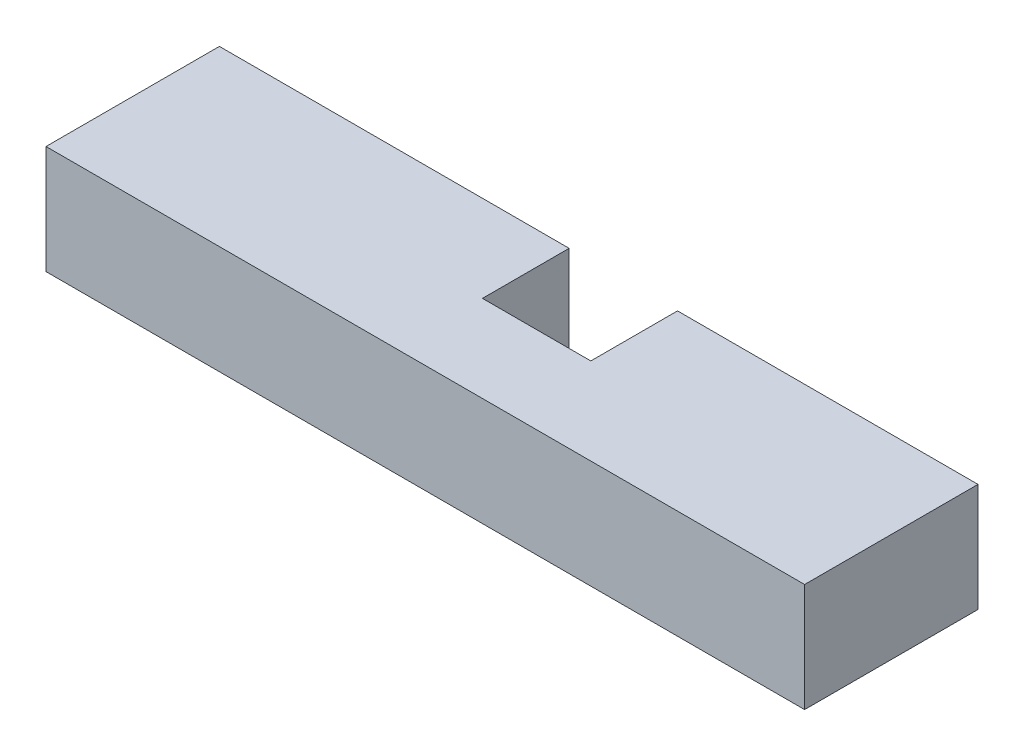
ISO-10303-21;
HEADER;
FILE_DESCRIPTION(('STEP AP214'),'2;1');
FILE_NAME('part.step','',(''),(''),'','','');
FILE_SCHEMA(('AUTOMOTIVE_DESIGN { 1 0 10303 214 1 1 1 1 }'));
ENDSEC;
DATA;
#1=APPLICATION_CONTEXT('core data for automotive mechanical design processes');
#2=APPLICATION_PROTOCOL_DEFINITION('international standard','automotive_design',2000,#1);
#3=PRODUCT_CONTEXT('',#1,'mechanical');
#4=PRODUCT('Part','Part','',(#3));
#5=PRODUCT_RELATED_PRODUCT_CATEGORY('part','',(#4));
#6=PRODUCT_DEFINITION_FORMATION('','',#4);
#7=PRODUCT_DEFINITION_CONTEXT('part definition',#1,'design');
#8=PRODUCT_DEFINITION('design','',#6,#7);
#9=PRODUCT_DEFINITION_SHAPE('','',#8);
#10=(LENGTH_UNIT() NAMED_UNIT(*) SI_UNIT(.MILLI.,.METRE.));
#11=(NAMED_UNIT(*) PLANE_ANGLE_UNIT() SI_UNIT($,.RADIAN.));
#12=(NAMED_UNIT(*) SI_UNIT($,.STERADIAN.) SOLID_ANGLE_UNIT());
#13=UNCERTAINTY_MEASURE_WITH_UNIT(LENGTH_MEASURE(1.E-05),#10,'distance_accuracy_value','');
#14=(GEOMETRIC_REPRESENTATION_CONTEXT(3) GLOBAL_UNCERTAINTY_ASSIGNED_CONTEXT((#13)) GLOBAL_UNIT_ASSIGNED_CONTEXT((#10,
#11,#12)) REPRESENTATION_CONTEXT('',''));
#15=CARTESIAN_POINT('',(0.,0.,0.));
#16=DIRECTION('',(0.,0.,1.));
#17=DIRECTION('',(1.,0.,0.));
#18=AXIS2_PLACEMENT_3D('',#15,#16,#17);
#19=CARTESIAN_POINT('',(0.,6.35,-5.08));
#20=DIRECTION('',(0.,0.,-1.));
#21=DIRECTION('',(-1.,0.,0.));
#22=AXIS2_PLACEMENT_3D('',#19,#20,#21);
#23=PLANE('',#22);
#24=DIRECTION('',(1.,0.,0.));
#25=VECTOR('',#24,1.);
#26=CARTESIAN_POINT('',(0.,0.,-5.08));
#27=LINE('',#26,#25);
#28=CARTESIAN_POINT('',(4.61790330864371,0.,-5.08));
#29=VERTEX_POINT('',#28);
#30=CARTESIAN_POINT('',(22.225,0.,-5.08));
#31=VERTEX_POINT('',#30);
#32=EDGE_CURVE('E128',#29,#31,#27,.T.);
#33=ORIENTED_EDGE('',*,*,#32,.F.);
#34=DIRECTION('',(0.,-1.,0.));
#35=VECTOR('',#34,1.);
#36=CARTESIAN_POINT('',(4.61790330864371,6.35,-5.08));
#37=LINE('',#36,#35);
#38=CARTESIAN_POINT('',(4.61790330864371,6.35,-5.08));
#39=VERTEX_POINT('',#38);
#40=EDGE_CURVE('E11',#39,#29,#37,.T.);
#41=ORIENTED_EDGE('',*,*,#40,.F.);
#42=DIRECTION('',(1.,0.,0.));
#43=VECTOR('',#42,1.);
#44=CARTESIAN_POINT('',(0.,6.35,-5.08));
#45=LINE('',#44,#43);
#46=CARTESIAN_POINT('',(22.225,6.35,-5.08));
#47=VERTEX_POINT('',#46);
#48=EDGE_CURVE('E147',#39,#47,#45,.T.);
#49=ORIENTED_EDGE('',*,*,#48,.T.);
#50=DIRECTION('',(0.,-1.,0.));
#51=VECTOR('',#50,1.);
#52=CARTESIAN_POINT('',(22.225,6.35,-5.08));
#53=LINE('',#52,#51);
#54=EDGE_CURVE('E85',#47,#31,#53,.T.);
#55=ORIENTED_EDGE('',*,*,#54,.T.);
#56=EDGE_LOOP('',(#33,#41,#49,#55));
#57=FACE_BOUND('',#56,.T.);
#58=ADVANCED_FACE('F35',(#57),#23,.T.);
#59=CARTESIAN_POINT('',(4.61790330864371,6.35,0.));
#60=DIRECTION('',(-1.,0.,0.));
#61=DIRECTION('',(0.,0.,1.));
#62=AXIS2_PLACEMENT_3D('',#59,#60,#61);
#63=PLANE('',#62);
#64=DIRECTION('',(0.,0.,-1.));
#65=VECTOR('',#64,1.);
#66=CARTESIAN_POINT('',(4.61790330864371,0.,0.));
#67=LINE('',#66,#65);
#68=CARTESIAN_POINT('',(4.61790330864371,0.,0.));
#69=VERTEX_POINT('',#68);
#70=EDGE_CURVE('E131',#69,#29,#67,.T.);
#71=ORIENTED_EDGE('',*,*,#70,.F.);
#72=DIRECTION('',(0.,-1.,0.));
#73=VECTOR('',#72,1.);
#74=CARTESIAN_POINT('',(4.61790330864371,6.35,0.));
#75=LINE('',#74,#73);
#76=CARTESIAN_POINT('',(4.61790330864371,6.35,0.));
#77=VERTEX_POINT('',#76);
#78=EDGE_CURVE('E43',#77,#69,#75,.T.);
#79=ORIENTED_EDGE('',*,*,#78,.F.);
#80=DIRECTION('',(0.,0.,-1.));
#81=VECTOR('',#80,1.);
#82=CARTESIAN_POINT('',(4.61790330864371,6.35,0.));
#83=LINE('',#82,#81);
#84=EDGE_CURVE('E173',#77,#39,#83,.T.);
#85=ORIENTED_EDGE('',*,*,#84,.T.);
#86=ORIENTED_EDGE('',*,*,#40,.T.);
#87=EDGE_LOOP('',(#71,#79,#85,#86));
#88=FACE_BOUND('',#87,.T.);
#89=ADVANCED_FACE('F164',(#88),#63,.T.);
#90=CARTESIAN_POINT('',(0.,6.35,0.));
#91=DIRECTION('',(0.,0.,-1.));
#92=DIRECTION('',(-1.,0.,0.));
#93=AXIS2_PLACEMENT_3D('',#90,#91,#92);
#94=PLANE('',#93);
#95=DIRECTION('',(1.,0.,0.));
#96=VECTOR('',#95,1.);
#97=CARTESIAN_POINT('',(0.,0.,0.));
#98=LINE('',#97,#96);
#99=CARTESIAN_POINT('',(-1.73209669135629,0.,0.));
#100=VERTEX_POINT('',#99);
#101=EDGE_CURVE('E134',#100,#69,#98,.T.);
#102=ORIENTED_EDGE('',*,*,#101,.F.);
#103=DIRECTION('',(0.,-1.,0.));
#104=VECTOR('',#103,1.);
#105=CARTESIAN_POINT('',(-1.73209669135629,6.35,0.));
#106=LINE('',#105,#104);
#107=CARTESIAN_POINT('',(-1.73209669135629,6.35,0.));
#108=VERTEX_POINT('',#107);
#109=EDGE_CURVE('E153',#108,#100,#106,.T.);
#110=ORIENTED_EDGE('',*,*,#109,.F.);
#111=DIRECTION('',(1.,0.,0.));
#112=VECTOR('',#111,1.);
#113=CARTESIAN_POINT('',(0.,6.35,0.));
#114=LINE('',#113,#112);
#115=EDGE_CURVE('E160',#108,#77,#114,.T.);
#116=ORIENTED_EDGE('',*,*,#115,.T.);
#117=ORIENTED_EDGE('',*,*,#78,.T.);
#118=EDGE_LOOP('',(#102,#110,#116,#117));
#119=FACE_BOUND('',#118,.T.);
#120=ADVANCED_FACE('F158',(#119),#94,.T.);
#121=CARTESIAN_POINT('',(-1.73209669135629,6.35,0.));
#122=DIRECTION('',(-1.,0.,0.));
#123=DIRECTION('',(0.,0.,1.));
#124=AXIS2_PLACEMENT_3D('',#121,#122,#123);
#125=PLANE('',#124);
#126=DIRECTION('',(0.,0.,-1.));
#127=VECTOR('',#126,1.);
#128=CARTESIAN_POINT('',(-1.73209669135629,0.,0.));
#129=LINE('',#128,#127);
#130=CARTESIAN_POINT('',(-1.73209669135629,0.,-5.08));
#131=VERTEX_POINT('',#130);
#132=EDGE_CURVE('E137',#100,#131,#129,.T.);
#133=ORIENTED_EDGE('',*,*,#132,.T.);
#134=DIRECTION('',(0.,-1.,0.));
#135=VECTOR('',#134,1.);
#136=CARTESIAN_POINT('',(-1.73209669135629,6.35,-5.08));
#137=LINE('',#136,#135);
#138=CARTESIAN_POINT('',(-1.73209669135629,6.35,-5.08));
#139=VERTEX_POINT('',#138);
#140=EDGE_CURVE('E151',#139,#131,#137,.T.);
#141=ORIENTED_EDGE('',*,*,#140,.F.);
#142=DIRECTION('',(0.,0.,-1.));
#143=VECTOR('',#142,1.);
#144=CARTESIAN_POINT('',(-1.73209669135629,6.35,0.));
#145=LINE('',#144,#143);
#146=EDGE_CURVE('E123',#108,#139,#145,.T.);
#147=ORIENTED_EDGE('',*,*,#146,.F.);
#148=ORIENTED_EDGE('',*,*,#109,.T.);
#149=EDGE_LOOP('',(#133,#141,#147,#148));
#150=FACE_BOUND('',#149,.T.);
#151=ADVANCED_FACE('F171',(#150),#125,.F.);
#152=CARTESIAN_POINT('',(0.,6.35,-5.08));
#153=DIRECTION('',(0.,0.,-1.));
#154=DIRECTION('',(-1.,0.,0.));
#155=AXIS2_PLACEMENT_3D('',#152,#153,#154);
#156=PLANE('',#155);
#157=DIRECTION('',(1.,0.,0.));
#158=VECTOR('',#157,1.);
#159=CARTESIAN_POINT('',(0.,0.,-5.08));
#160=LINE('',#159,#158);
#161=CARTESIAN_POINT('',(-22.225,0.,-5.08));
#162=VERTEX_POINT('',#161);
#163=EDGE_CURVE('E140',#162,#131,#160,.T.);
#164=ORIENTED_EDGE('',*,*,#163,.F.);
#165=DIRECTION('',(0.,-1.,0.));
#166=VECTOR('',#165,1.);
#167=CARTESIAN_POINT('',(-22.225,6.35,-5.08));
#168=LINE('',#167,#166);
#169=CARTESIAN_POINT('',(-22.225,6.35,-5.08));
#170=VERTEX_POINT('',#169);
#171=EDGE_CURVE('E112',#170,#162,#168,.T.);
#172=ORIENTED_EDGE('',*,*,#171,.F.);
#173=DIRECTION('',(1.,0.,0.));
#174=VECTOR('',#173,1.);
#175=CARTESIAN_POINT('',(0.,6.35,-5.08));
#176=LINE('',#175,#174);
#177=EDGE_CURVE('E121',#170,#139,#176,.T.);
#178=ORIENTED_EDGE('',*,*,#177,.T.);
#179=ORIENTED_EDGE('',*,*,#140,.T.);
#180=EDGE_LOOP('',(#164,#172,#178,#179));
#181=FACE_BOUND('',#180,.T.);
#182=ADVANCED_FACE('F188',(#181),#156,.T.);
#183=CARTESIAN_POINT('',(-22.225,6.35,0.));
#184=DIRECTION('',(-1.,0.,0.));
#185=DIRECTION('',(0.,0.,1.));
#186=AXIS2_PLACEMENT_3D('',#183,#184,#185);
#187=PLANE('',#186);
#188=DIRECTION('',(0.,0.,-1.));
#189=VECTOR('',#188,1.);
#190=CARTESIAN_POINT('',(-22.225,0.,0.));
#191=LINE('',#190,#189);
#192=CARTESIAN_POINT('',(-22.225,0.,5.08));
#193=VERTEX_POINT('',#192);
#194=EDGE_CURVE('E111',#193,#162,#191,.T.);
#195=ORIENTED_EDGE('',*,*,#194,.F.);
#196=DIRECTION('',(0.,-1.,0.));
#197=VECTOR('',#196,1.);
#198=CARTESIAN_POINT('',(-22.225,6.35,5.08));
#199=LINE('',#198,#197);
#200=CARTESIAN_POINT('',(-22.225,6.35,5.08));
#201=VERTEX_POINT('',#200);
#202=EDGE_CURVE('E105',#201,#193,#199,.T.);
#203=ORIENTED_EDGE('',*,*,#202,.F.);
#204=DIRECTION('',(0.,0.,-1.));
#205=VECTOR('',#204,1.);
#206=CARTESIAN_POINT('',(-22.225,6.35,0.));
#207=LINE('',#206,#205);
#208=EDGE_CURVE('E109',#201,#170,#207,.T.);
#209=ORIENTED_EDGE('',*,*,#208,.T.);
#210=ORIENTED_EDGE('',*,*,#171,.T.);
#211=EDGE_LOOP('',(#195,#203,#209,#210));
#212=FACE_BOUND('',#211,.T.);
#213=ADVANCED_FACE('F107',(#212),#187,.T.);
#214=CARTESIAN_POINT('',(0.,6.35,5.08));
#215=DIRECTION('',(0.,0.,-1.));
#216=DIRECTION('',(-1.,0.,0.));
#217=AXIS2_PLACEMENT_3D('',#214,#215,#216);
#218=PLANE('',#217);
#219=DIRECTION('',(1.,0.,0.));
#220=VECTOR('',#219,1.);
#221=CARTESIAN_POINT('',(0.,0.,5.08));
#222=LINE('',#221,#220);
#223=CARTESIAN_POINT('',(22.225,0.,5.08));
#224=VERTEX_POINT('',#223);
#225=EDGE_CURVE('E78',#193,#224,#222,.T.);
#226=ORIENTED_EDGE('',*,*,#225,.T.);
#227=DIRECTION('',(0.,-1.,0.));
#228=VECTOR('',#227,1.);
#229=CARTESIAN_POINT('',(22.225,6.35,5.08));
#230=LINE('',#229,#228);
#231=CARTESIAN_POINT('',(22.225,6.35,5.08));
#232=VERTEX_POINT('',#231);
#233=EDGE_CURVE('E113',#232,#224,#230,.T.);
#234=ORIENTED_EDGE('',*,*,#233,.F.);
#235=DIRECTION('',(1.,0.,0.));
#236=VECTOR('',#235,1.);
#237=CARTESIAN_POINT('',(0.,6.35,5.08));
#238=LINE('',#237,#236);
#239=EDGE_CURVE('E115',#201,#232,#238,.T.);
#240=ORIENTED_EDGE('',*,*,#239,.F.);
#241=ORIENTED_EDGE('',*,*,#202,.T.);
#242=EDGE_LOOP('',(#226,#234,#240,#241));
#243=FACE_BOUND('',#242,.T.);
#244=ADVANCED_FACE('F116',(#243),#218,.F.);
#245=CARTESIAN_POINT('',(22.225,6.35,0.));
#246=DIRECTION('',(-1.,0.,0.));
#247=DIRECTION('',(0.,0.,1.));
#248=AXIS2_PLACEMENT_3D('',#245,#246,#247);
#249=PLANE('',#248);
#250=DIRECTION('',(0.,0.,-1.));
#251=VECTOR('',#250,1.);
#252=CARTESIAN_POINT('',(22.225,0.,0.));
#253=LINE('',#252,#251);
#254=EDGE_CURVE('E145',#224,#31,#253,.T.);
#255=ORIENTED_EDGE('',*,*,#254,.T.);
#256=ORIENTED_EDGE('',*,*,#54,.F.);
#257=DIRECTION('',(0.,0.,-1.));
#258=VECTOR('',#257,1.);
#259=CARTESIAN_POINT('',(22.225,6.35,0.));
#260=LINE('',#259,#258);
#261=EDGE_CURVE('E51',#232,#47,#260,.T.);
#262=ORIENTED_EDGE('',*,*,#261,.F.);
#263=ORIENTED_EDGE('',*,*,#233,.T.);
#264=EDGE_LOOP('',(#255,#256,#262,#263));
#265=FACE_BOUND('',#264,.T.);
#266=ADVANCED_FACE('F196',(#265),#249,.F.);
#267=CARTESIAN_POINT('',(0.,6.35,0.));
#268=DIRECTION('',(0.,1.,0.));
#269=DIRECTION('',(0.,0.,1.));
#270=AXIS2_PLACEMENT_3D('',#267,#268,#269);
#271=PLANE('',#270);
#272=ORIENTED_EDGE('',*,*,#48,.F.);
#273=ORIENTED_EDGE('',*,*,#84,.F.);
#274=ORIENTED_EDGE('',*,*,#115,.F.);
#275=ORIENTED_EDGE('',*,*,#146,.T.);
#276=ORIENTED_EDGE('',*,*,#177,.F.);
#277=ORIENTED_EDGE('',*,*,#208,.F.);
#278=ORIENTED_EDGE('',*,*,#239,.T.);
#279=ORIENTED_EDGE('',*,*,#261,.T.);
#280=EDGE_LOOP('',(#272,#273,#274,#275,#276,#277,#278,#279));
#281=FACE_BOUND('',#280,.T.);
#282=ADVANCED_FACE('F119',(#281),#271,.T.);
#283=CARTESIAN_POINT('',(0.,0.,0.));
#284=DIRECTION('',(0.,1.,0.));
#285=DIRECTION('',(0.,0.,1.));
#286=AXIS2_PLACEMENT_3D('',#283,#284,#285);
#287=PLANE('',#286);
#288=ORIENTED_EDGE('',*,*,#32,.T.);
#289=ORIENTED_EDGE('',*,*,#254,.F.);
#290=ORIENTED_EDGE('',*,*,#225,.F.);
#291=ORIENTED_EDGE('',*,*,#194,.T.);
#292=ORIENTED_EDGE('',*,*,#163,.T.);
#293=ORIENTED_EDGE('',*,*,#132,.F.);
#294=ORIENTED_EDGE('',*,*,#101,.T.);
#295=ORIENTED_EDGE('',*,*,#70,.T.);
#296=EDGE_LOOP('',(#288,#289,#290,#291,#292,#293,#294,#295));
#297=FACE_BOUND('',#296,.T.);
#298=ADVANCED_FACE('F167',(#297),#287,.F.);
#299=CLOSED_SHELL('',(#58,#89,#120,#151,#182,#213,#244,#266,#282,#298));
#300=MANIFOLD_SOLID_BREP('B2',#299);
#301=ADVANCED_BREP_SHAPE_REPRESENTATION('',(#18,#300),#14);
#302=SHAPE_DEFINITION_REPRESENTATION(#9,#301);
ENDSEC;
END-ISO-10303-21;
